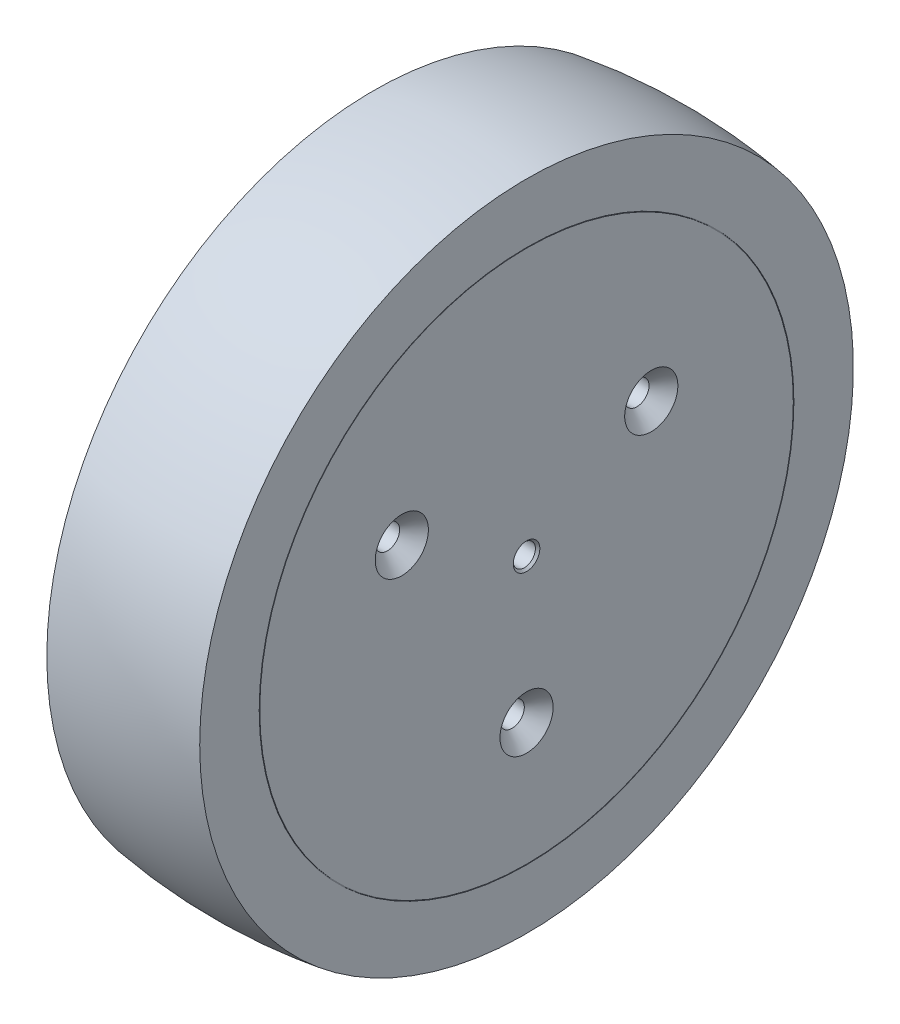
ISO-10303-21;
HEADER;
FILE_DESCRIPTION(('STEP AP214'),'2;1');
FILE_NAME('part.step','',(''),(''),'','','');
FILE_SCHEMA(('AUTOMOTIVE_DESIGN { 1 0 10303 214 1 1 1 1 }'));
ENDSEC;
DATA;
#1=APPLICATION_CONTEXT('core data for automotive mechanical design processes');
#2=APPLICATION_PROTOCOL_DEFINITION('international standard','automotive_design',2000,#1);
#3=PRODUCT_CONTEXT('',#1,'mechanical');
#4=PRODUCT('Part','Part','',(#3));
#5=PRODUCT_RELATED_PRODUCT_CATEGORY('part','',(#4));
#6=PRODUCT_DEFINITION_FORMATION('','',#4);
#7=PRODUCT_DEFINITION_CONTEXT('part definition',#1,'design');
#8=PRODUCT_DEFINITION('design','',#6,#7);
#9=PRODUCT_DEFINITION_SHAPE('','',#8);
#10=(LENGTH_UNIT() NAMED_UNIT(*) SI_UNIT(.MILLI.,.METRE.));
#11=(NAMED_UNIT(*) PLANE_ANGLE_UNIT() SI_UNIT($,.RADIAN.));
#12=(NAMED_UNIT(*) SI_UNIT($,.STERADIAN.) SOLID_ANGLE_UNIT());
#13=UNCERTAINTY_MEASURE_WITH_UNIT(LENGTH_MEASURE(1.E-05),#10,'distance_accuracy_value','');
#14=(GEOMETRIC_REPRESENTATION_CONTEXT(3) GLOBAL_UNCERTAINTY_ASSIGNED_CONTEXT((#13)) GLOBAL_UNIT_ASSIGNED_CONTEXT((#10,
#11,#12)) REPRESENTATION_CONTEXT('',''));
#15=CARTESIAN_POINT('',(0.,0.,0.));
#16=DIRECTION('',(0.,0.,1.));
#17=DIRECTION('',(1.,0.,0.));
#18=AXIS2_PLACEMENT_3D('',#15,#16,#17);
#19=CARTESIAN_POINT('',(0.,-60.3117360156316,-1.26495999176649));
#20=DIRECTION('',(-1.,0.,0.));
#21=DIRECTION('',(0.,0.,1.));
#22=AXIS2_PLACEMENT_3D('',#19,#20,#21);
#23=PLANE('',#22);
#24=CARTESIAN_POINT('',(0.,0.,0.));
#25=DIRECTION('',(1.,0.,0.));
#26=DIRECTION('',(0.,0.,-1.));
#27=AXIS2_PLACEMENT_3D('',#24,#25,#26);
#28=CIRCLE('',#27,56.325);
#29=CARTESIAN_POINT('',(0.,0.,-56.325));
#30=VERTEX_POINT('',#29);
#31=EDGE_CURVE('E49',#30,#30,#28,.T.);
#32=ORIENTED_EDGE('',*,*,#31,.T.);
#33=EDGE_LOOP('',(#32));
#34=FACE_BOUND('',#33,.T.);
#35=CARTESIAN_POINT('',(0.,0.,0.));
#36=DIRECTION('',(-1.,0.,0.));
#37=DIRECTION('',(0.,0.,1.));
#38=AXIS2_PLACEMENT_3D('',#35,#36,#37);
#39=CIRCLE('',#38,60.198);
#40=CARTESIAN_POINT('',(0.,0.,60.198));
#41=VERTEX_POINT('',#40);
#42=EDGE_CURVE('E146',#41,#41,#39,.T.);
#43=ORIENTED_EDGE('',*,*,#42,.T.);
#44=EDGE_LOOP('',(#43));
#45=FACE_BOUND('',#44,.T.);
#46=ADVANCED_FACE('F36',(#34,#45),#23,.T.);
#47=CARTESIAN_POINT('',(34.5,-73.7337841881944,-1.54646994434776));
#48=DIRECTION('',(1.,0.,0.));
#49=DIRECTION('',(0.,0.,-1.));
#50=AXIS2_PLACEMENT_3D('',#47,#48,#49);
#51=PLANE('',#50);
#52=CARTESIAN_POINT('',(34.4999999199445,-32.5,0.));
#53=DIRECTION('',(1.,0.,0.));
#54=DIRECTION('',(0.,0.,-1.));
#55=AXIS2_PLACEMENT_3D('',#52,#53,#54);
#56=CIRCLE('',#55,6.00000000002865);
#57=CARTESIAN_POINT('',(34.4999999199445,-32.5,-6.00000000002865));
#58=VERTEX_POINT('',#57);
#59=EDGE_CURVE('E72',#58,#58,#56,.F.);
#60=ORIENTED_EDGE('',*,*,#59,.T.);
#61=EDGE_LOOP('',(#60));
#62=FACE_BOUND('',#61,.T.);
#63=CARTESIAN_POINT('',(34.4999999199379,16.25,-28.1458256229943));
#64=DIRECTION('',(1.,0.,0.));
#65=DIRECTION('',(0.,0.,-1.));
#66=AXIS2_PLACEMENT_3D('',#63,#64,#65);
#67=CIRCLE('',#66,6.00000000001094);
#68=CARTESIAN_POINT('',(34.4999999199379,16.25,-34.1458256230052));
#69=VERTEX_POINT('',#68);
#70=EDGE_CURVE('E67',#69,#69,#67,.F.);
#71=ORIENTED_EDGE('',*,*,#70,.T.);
#72=EDGE_LOOP('',(#71));
#73=FACE_BOUND('',#72,.T.);
#74=CARTESIAN_POINT('',(34.4999999199445,16.25,28.1458256229943));
#75=DIRECTION('',(1.,0.,0.));
#76=DIRECTION('',(0.,0.,-1.));
#77=AXIS2_PLACEMENT_3D('',#74,#75,#76);
#78=CIRCLE('',#77,5.9999999999642);
#79=CARTESIAN_POINT('',(34.4999999199445,16.25,22.1458256230301));
#80=VERTEX_POINT('',#79);
#81=EDGE_CURVE('E62',#80,#80,#78,.F.);
#82=ORIENTED_EDGE('',*,*,#81,.T.);
#83=EDGE_LOOP('',(#82));
#84=FACE_BOUND('',#83,.T.);
#85=CARTESIAN_POINT('',(34.4999999199445,0.,0.));
#86=DIRECTION('',(1.,0.,0.));
#87=DIRECTION('',(0.,0.,-1.));
#88=AXIS2_PLACEMENT_3D('',#85,#86,#87);
#89=CIRCLE('',#88,2.99999999992906);
#90=CARTESIAN_POINT('',(34.4999999199445,0.,-2.99999999992906));
#91=VERTEX_POINT('',#90);
#92=EDGE_CURVE('E57',#91,#91,#89,.F.);
#93=ORIENTED_EDGE('',*,*,#92,.T.);
#94=EDGE_LOOP('',(#93));
#95=FACE_BOUND('',#94,.T.);
#96=CARTESIAN_POINT('',(34.5,0.,0.));
#97=DIRECTION('',(1.,0.,0.));
#98=DIRECTION('',(0.,0.,-1.));
#99=AXIS2_PLACEMENT_3D('',#96,#97,#98);
#100=CIRCLE('',#99,60.198);
#101=CARTESIAN_POINT('',(34.5,0.,-60.198));
#102=VERTEX_POINT('',#101);
#103=EDGE_CURVE('E134',#102,#102,#100,.T.);
#104=ORIENTED_EDGE('',*,*,#103,.T.);
#105=EDGE_LOOP('',(#104));
#106=FACE_BOUND('',#105,.T.);
#107=ADVANCED_FACE('F179',(#62,#73,#84,#95,#106),#51,.T.);
#108=CARTESIAN_POINT('',(27.9999999199845,0.,0.));
#109=DIRECTION('',(-1.,0.,0.));
#110=DIRECTION('',(0.,0.,1.));
#111=AXIS2_PLACEMENT_3D('',#108,#109,#110);
#112=CONICAL_SURFACE('',#111,3.49999999991724,0.785398163397448);
#113=CARTESIAN_POINT('',(27.9999999199276,0.,0.));
#114=DIRECTION('',(-1.,0.,0.));
#115=DIRECTION('',(0.,0.,1.));
#116=AXIS2_PLACEMENT_3D('',#113,#114,#115);
#117=CIRCLE('',#116,3.49999999997408);
#118=CARTESIAN_POINT('',(27.9999999199276,0.,3.49999999997408));
#119=VERTEX_POINT('',#118);
#120=EDGE_CURVE('E85',#119,#119,#117,.F.);
#121=ORIENTED_EDGE('',*,*,#120,.F.);
#122=EDGE_LOOP('',(#121));
#123=FACE_BOUND('',#122,.T.);
#124=CARTESIAN_POINT('',(28.9999999199296,0.,0.));
#125=DIRECTION('',(1.,0.,0.));
#126=DIRECTION('',(0.,0.,-1.));
#127=AXIS2_PLACEMENT_3D('',#124,#125,#126);
#128=CIRCLE('',#127,2.5);
#129=CARTESIAN_POINT('',(28.9999999199296,0.,-2.5));
#130=VERTEX_POINT('',#129);
#131=EDGE_CURVE('E102',#130,#130,#128,.T.);
#132=ORIENTED_EDGE('',*,*,#131,.T.);
#133=EDGE_LOOP('',(#132));
#134=FACE_BOUND('',#133,.T.);
#135=ADVANCED_FACE('F192',(#123,#134),#112,.F.);
#136=CARTESIAN_POINT('',(-139.577841847698,-32.5,0.));
#137=DIRECTION('',(1.,0.,0.));
#138=DIRECTION('',(0.,0.,-1.));
#139=AXIS2_PLACEMENT_3D('',#136,#137,#138);
#140=CYLINDRICAL_SURFACE('',#139,2.75);
#141=CARTESIAN_POINT('',(31.2499999199076,-32.5,0.));
#142=DIRECTION('',(1.,0.,0.));
#143=DIRECTION('',(0.,0.,-1.));
#144=AXIS2_PLACEMENT_3D('',#141,#142,#143);
#145=CIRCLE('',#144,2.74999999999181);
#146=CARTESIAN_POINT('',(31.2499999199076,-32.5,-2.74999999999181));
#147=VERTEX_POINT('',#146);
#148=EDGE_CURVE('E88',#147,#147,#145,.T.);
#149=ORIENTED_EDGE('',*,*,#148,.T.);
#150=EDGE_LOOP('',(#149));
#151=FACE_BOUND('',#150,.T.);
#152=CARTESIAN_POINT('',(27.9999999199296,-32.5,0.));
#153=DIRECTION('',(1.,0.,0.));
#154=DIRECTION('',(0.,0.,-1.));
#155=AXIS2_PLACEMENT_3D('',#152,#153,#154);
#156=CIRCLE('',#155,2.75);
#157=CARTESIAN_POINT('',(27.9999999199296,-32.5,-2.75));
#158=VERTEX_POINT('',#157);
#159=EDGE_CURVE('E99',#158,#158,#156,.T.);
#160=ORIENTED_EDGE('',*,*,#159,.F.);
#161=EDGE_LOOP('',(#160));
#162=FACE_BOUND('',#161,.T.);
#163=ADVANCED_FACE('F215',(#151,#162),#140,.F.);
#164=CARTESIAN_POINT('',(-139.577841847698,16.25,-28.1458256229943));
#165=DIRECTION('',(1.,0.,0.));
#166=DIRECTION('',(0.,0.,-1.));
#167=AXIS2_PLACEMENT_3D('',#164,#165,#166);
#168=CYLINDRICAL_SURFACE('',#167,2.75);
#169=CARTESIAN_POINT('',(31.2499999199076,16.25,-28.1458256229943));
#170=DIRECTION('',(1.,0.,0.));
#171=DIRECTION('',(0.,0.86602540377722,0.500000000012503));
#172=AXIS2_PLACEMENT_3D('',#169,#170,#171);
#173=CIRCLE('',#172,2.74999999996927);
#174=CARTESIAN_POINT('',(31.2499999199076,18.6315698603607,-26.7708256229753));
#175=VERTEX_POINT('',#174);
#176=EDGE_CURVE('E117',#175,#175,#173,.T.);
#177=ORIENTED_EDGE('',*,*,#176,.T.);
#178=EDGE_LOOP('',(#177));
#179=FACE_BOUND('',#178,.T.);
#180=CARTESIAN_POINT('',(27.9999999199296,16.25,-28.1458256229943));
#181=DIRECTION('',(1.,0.,0.));
#182=DIRECTION('',(0.,0.,-1.));
#183=AXIS2_PLACEMENT_3D('',#180,#181,#182);
#184=CIRCLE('',#183,2.75);
#185=CARTESIAN_POINT('',(27.9999999199296,16.25,-30.8958256229943));
#186=VERTEX_POINT('',#185);
#187=EDGE_CURVE('E94',#186,#186,#184,.T.);
#188=ORIENTED_EDGE('',*,*,#187,.F.);
#189=EDGE_LOOP('',(#188));
#190=FACE_BOUND('',#189,.T.);
#191=ADVANCED_FACE('F219',(#179,#190),#168,.F.);
#192=CARTESIAN_POINT('',(-139.577841847698,16.25,28.1458256229943));
#193=DIRECTION('',(1.,0.,0.));
#194=DIRECTION('',(0.,0.,-1.));
#195=AXIS2_PLACEMENT_3D('',#192,#193,#194);
#196=CYLINDRICAL_SURFACE('',#195,2.75);
#197=CARTESIAN_POINT('',(31.2499999199076,16.25,28.1458256229943));
#198=DIRECTION('',(1.,0.,0.));
#199=DIRECTION('',(0.,-0.866025403787185,0.499999999995243));
#200=AXIS2_PLACEMENT_3D('',#197,#198,#199);
#201=CIRCLE('',#200,2.74999999997176);
#202=CARTESIAN_POINT('',(31.2499999199076,13.8684301396097,29.5208256229671));
#203=VERTEX_POINT('',#202);
#204=EDGE_CURVE('E122',#203,#203,#201,.T.);
#205=ORIENTED_EDGE('',*,*,#204,.T.);
#206=EDGE_LOOP('',(#205));
#207=FACE_BOUND('',#206,.T.);
#208=CARTESIAN_POINT('',(27.9999999199296,16.25,28.1458256229943));
#209=DIRECTION('',(1.,0.,0.));
#210=DIRECTION('',(0.,0.,-1.));
#211=AXIS2_PLACEMENT_3D('',#208,#209,#210);
#212=CIRCLE('',#211,2.75);
#213=CARTESIAN_POINT('',(27.9999999199296,16.25,25.3958256229943));
#214=VERTEX_POINT('',#213);
#215=EDGE_CURVE('E89',#214,#214,#212,.T.);
#216=ORIENTED_EDGE('',*,*,#215,.F.);
#217=EDGE_LOOP('',(#216));
#218=FACE_BOUND('',#217,.T.);
#219=ADVANCED_FACE('F226',(#207,#218),#196,.F.);
#220=CARTESIAN_POINT('',(31.2499999199296,0.,0.));
#221=DIRECTION('',(1.,0.,0.));
#222=DIRECTION('',(0.,0.,-1.));
#223=AXIS2_PLACEMENT_3D('',#220,#221,#222);
#224=CYLINDRICAL_SURFACE('',#223,2.5);
#225=ORIENTED_EDGE('',*,*,#131,.F.);
#226=EDGE_LOOP('',(#225));
#227=FACE_BOUND('',#226,.T.);
#228=CARTESIAN_POINT('',(33.9999999200131,0.,0.));
#229=DIRECTION('',(1.,0.,0.));
#230=DIRECTION('',(0.,-1.,0.));
#231=AXIS2_PLACEMENT_3D('',#228,#229,#230);
#232=CIRCLE('',#231,2.49999999999773);
#233=CARTESIAN_POINT('',(33.9999999200131,-2.49999999999773,0.));
#234=VERTEX_POINT('',#233);
#235=EDGE_CURVE('E82',#234,#234,#232,.T.);
#236=ORIENTED_EDGE('',*,*,#235,.T.);
#237=EDGE_LOOP('',(#236));
#238=FACE_BOUND('',#237,.T.);
#239=ADVANCED_FACE('F230',(#227,#238),#224,.F.);
#240=CARTESIAN_POINT('',(27.9999999199296,56.325,0.));
#241=DIRECTION('',(-1.,0.,0.));
#242=DIRECTION('',(0.,0.,1.));
#243=AXIS2_PLACEMENT_3D('',#240,#241,#242);
#244=PLANE('',#243);
#245=ORIENTED_EDGE('',*,*,#120,.T.);
#246=EDGE_LOOP('',(#245));
#247=FACE_BOUND('',#246,.T.);
#248=ORIENTED_EDGE('',*,*,#215,.T.);
#249=EDGE_LOOP('',(#248));
#250=FACE_BOUND('',#249,.T.);
#251=ORIENTED_EDGE('',*,*,#187,.T.);
#252=EDGE_LOOP('',(#251));
#253=FACE_BOUND('',#252,.T.);
#254=ORIENTED_EDGE('',*,*,#159,.T.);
#255=EDGE_LOOP('',(#254));
#256=FACE_BOUND('',#255,.T.);
#257=CARTESIAN_POINT('',(27.9999999199296,0.,0.));
#258=DIRECTION('',(1.,0.,0.));
#259=DIRECTION('',(0.,0.,-1.));
#260=AXIS2_PLACEMENT_3D('',#257,#258,#259);
#261=CIRCLE('',#260,56.325);
#262=CARTESIAN_POINT('',(27.9999999199296,0.,-56.325));
#263=VERTEX_POINT('',#262);
#264=EDGE_CURVE('E77',#263,#263,#261,.F.);
#265=ORIENTED_EDGE('',*,*,#264,.T.);
#266=EDGE_LOOP('',(#265));
#267=FACE_BOUND('',#266,.T.);
#268=ADVANCED_FACE('F234',(#247,#250,#253,#256,#267),#244,.T.);
#269=CARTESIAN_POINT('',(34.4999999199445,-32.5,0.));
#270=DIRECTION('',(1.,0.,0.));
#271=DIRECTION('',(0.,0.,-1.));
#272=AXIS2_PLACEMENT_3D('',#269,#270,#271);
#273=CONICAL_SURFACE('',#272,6.00000000002865,0.785398163397448);
#274=ORIENTED_EDGE('',*,*,#148,.F.);
#275=EDGE_LOOP('',(#274));
#276=FACE_BOUND('',#275,.T.);
#277=ORIENTED_EDGE('',*,*,#59,.F.);
#278=EDGE_LOOP('',(#277));
#279=FACE_BOUND('',#278,.T.);
#280=ADVANCED_FACE('F237',(#276,#279),#273,.F.);
#281=CARTESIAN_POINT('',(34.4999999200013,16.25,-28.1458256229943));
#282=DIRECTION('',(1.,0.,0.));
#283=DIRECTION('',(0.,0.,-1.));
#284=AXIS2_PLACEMENT_3D('',#281,#282,#283);
#285=CONICAL_SURFACE('',#284,6.00000000007438,0.785398163399207);
#286=ORIENTED_EDGE('',*,*,#176,.F.);
#287=EDGE_LOOP('',(#286));
#288=FACE_BOUND('',#287,.T.);
#289=ORIENTED_EDGE('',*,*,#70,.F.);
#290=EDGE_LOOP('',(#289));
#291=FACE_BOUND('',#290,.T.);
#292=ADVANCED_FACE('F241',(#288,#291),#285,.F.);
#293=CARTESIAN_POINT('',(34.4999999199445,16.25,28.1458256229943));
#294=DIRECTION('',(1.,0.,0.));
#295=DIRECTION('',(0.,0.,-1.));
#296=AXIS2_PLACEMENT_3D('',#293,#294,#295);
#297=CONICAL_SURFACE('',#296,5.9999999999642,0.785398163398349);
#298=ORIENTED_EDGE('',*,*,#204,.F.);
#299=EDGE_LOOP('',(#298));
#300=FACE_BOUND('',#299,.T.);
#301=ORIENTED_EDGE('',*,*,#81,.F.);
#302=EDGE_LOOP('',(#301));
#303=FACE_BOUND('',#302,.T.);
#304=ADVANCED_FACE('F245',(#300,#303),#297,.F.);
#305=CARTESIAN_POINT('',(34.4999999199445,0.,0.));
#306=DIRECTION('',(1.,0.,0.));
#307=DIRECTION('',(0.,0.,-1.));
#308=AXIS2_PLACEMENT_3D('',#305,#306,#307);
#309=CONICAL_SURFACE('',#308,2.99999999992906,0.785398163397448);
#310=ORIENTED_EDGE('',*,*,#235,.F.);
#311=EDGE_LOOP('',(#310));
#312=FACE_BOUND('',#311,.T.);
#313=ORIENTED_EDGE('',*,*,#92,.F.);
#314=EDGE_LOOP('',(#313));
#315=FACE_BOUND('',#314,.T.);
#316=ADVANCED_FACE('F249',(#312,#315),#309,.F.);
#317=CARTESIAN_POINT('',(13.9999999599648,0.,0.));
#318=DIRECTION('',(1.,0.,0.));
#319=DIRECTION('',(0.,0.,-1.));
#320=AXIS2_PLACEMENT_3D('',#317,#318,#319);
#321=CYLINDRICAL_SURFACE('',#320,56.325);
#322=ORIENTED_EDGE('',*,*,#31,.F.);
#323=EDGE_LOOP('',(#322));
#324=FACE_BOUND('',#323,.T.);
#325=ORIENTED_EDGE('',*,*,#264,.F.);
#326=EDGE_LOOP('',(#325));
#327=FACE_BOUND('',#326,.T.);
#328=ADVANCED_FACE('F181',(#324,#327),#321,.F.);
#329=CARTESIAN_POINT('',(34.5,0.,0.));
#330=DIRECTION('',(1.,0.,0.));
#331=DIRECTION('',(0.,0.,-1.));
#332=AXIS2_PLACEMENT_3D('',#329,#330,#331);
#333=CIRCLE('',#332,60.325);
#334=CARTESIAN_POINT('',(34.5,0.,-60.325));
#335=VERTEX_POINT('',#334);
#336=EDGE_CURVE('E110',#335,#335,#333,.T.);
#337=ORIENTED_EDGE('',*,*,#336,.F.);
#338=EDGE_LOOP('',(#337));
#339=FACE_BOUND('',#338,.T.);
#340=CARTESIAN_POINT('',(34.5,0.,0.));
#341=DIRECTION('',(-1.,0.,0.));
#342=DIRECTION('',(0.,0.,1.));
#343=AXIS2_PLACEMENT_3D('',#340,#341,#342);
#344=CIRCLE('',#343,73.75);
#345=CARTESIAN_POINT('',(34.5,0.,73.75));
#346=VERTEX_POINT('',#345);
#347=EDGE_CURVE('E44',#346,#346,#344,.F.);
#348=ORIENTED_EDGE('',*,*,#347,.T.);
#349=EDGE_LOOP('',(#348));
#350=FACE_BOUND('',#349,.T.);
#351=ADVANCED_FACE('F170',(#339,#350),#51,.T.);
#352=CARTESIAN_POINT('',(0.,0.,0.));
#353=DIRECTION('',(-1.,0.,0.));
#354=DIRECTION('',(0.,0.,1.));
#355=AXIS2_PLACEMENT_3D('',#352,#353,#354);
#356=CIRCLE('',#355,60.325);
#357=CARTESIAN_POINT('',(0.,0.,60.325));
#358=VERTEX_POINT('',#357);
#359=EDGE_CURVE('E140',#358,#358,#356,.T.);
#360=ORIENTED_EDGE('',*,*,#359,.F.);
#361=EDGE_LOOP('',(#360));
#362=FACE_BOUND('',#361,.T.);
#363=CARTESIAN_POINT('',(0.,0.,0.));
#364=DIRECTION('',(-1.,0.,0.));
#365=DIRECTION('',(0.,0.,1.));
#366=AXIS2_PLACEMENT_3D('',#363,#364,#365);
#367=CIRCLE('',#366,73.75);
#368=CARTESIAN_POINT('',(0.,0.,73.75));
#369=VERTEX_POINT('',#368);
#370=EDGE_CURVE('E10',#369,#369,#367,.T.);
#371=ORIENTED_EDGE('',*,*,#370,.T.);
#372=EDGE_LOOP('',(#371));
#373=FACE_BOUND('',#372,.T.);
#374=ADVANCED_FACE('F168',(#362,#373),#23,.T.);
#375=CARTESIAN_POINT('',(17.25,0.,0.));
#376=DIRECTION('',(-1.,0.,0.));
#377=DIRECTION('',(0.,0.,1.));
#378=AXIS2_PLACEMENT_3D('',#375,#376,#377);
#379=DEGENERATE_TOROIDAL_SURFACE('',#378,44.6499999999984,119.649999999998,.F.);
#380=ORIENTED_EDGE('',*,*,#347,.F.);
#381=EDGE_LOOP('',(#380));
#382=FACE_BOUND('',#381,.T.);
#383=ORIENTED_EDGE('',*,*,#370,.F.);
#384=EDGE_LOOP('',(#383));
#385=FACE_BOUND('',#384,.T.);
#386=ADVANCED_FACE('F38',(#382,#385),#379,.F.);
#387=CARTESIAN_POINT('',(34.246,0.,0.));
#388=DIRECTION('',(1.,0.,0.));
#389=DIRECTION('',(0.,0.,-1.));
#390=AXIS2_PLACEMENT_3D('',#387,#388,#389);
#391=CYLINDRICAL_SURFACE('',#390,60.325);
#392=CARTESIAN_POINT('',(34.246,0.,0.));
#393=DIRECTION('',(1.,0.,0.));
#394=DIRECTION('',(0.,0.,-1.));
#395=AXIS2_PLACEMENT_3D('',#392,#393,#394);
#396=CIRCLE('',#395,60.325);
#397=CARTESIAN_POINT('',(34.246,0.,-60.325));
#398=VERTEX_POINT('',#397);
#399=EDGE_CURVE('E106',#398,#398,#396,.T.);
#400=ORIENTED_EDGE('',*,*,#399,.F.);
#401=EDGE_LOOP('',(#400));
#402=FACE_BOUND('',#401,.T.);
#403=ORIENTED_EDGE('',*,*,#336,.T.);
#404=EDGE_LOOP('',(#403));
#405=FACE_BOUND('',#404,.T.);
#406=ADVANCED_FACE('F177',(#402,#405),#391,.F.);
#407=CARTESIAN_POINT('',(34.246,0.,0.));
#408=DIRECTION('',(1.,0.,0.));
#409=DIRECTION('',(0.,0.,-1.));
#410=AXIS2_PLACEMENT_3D('',#407,#408,#409);
#411=PLANE('',#410);
#412=CARTESIAN_POINT('',(34.246,0.,0.));
#413=DIRECTION('',(1.,0.,0.));
#414=DIRECTION('',(0.,0.,-1.));
#415=AXIS2_PLACEMENT_3D('',#412,#413,#414);
#416=CIRCLE('',#415,60.198);
#417=CARTESIAN_POINT('',(34.246,0.,-60.198));
#418=VERTEX_POINT('',#417);
#419=EDGE_CURVE('E132',#418,#418,#416,.T.);
#420=ORIENTED_EDGE('',*,*,#419,.F.);
#421=EDGE_LOOP('',(#420));
#422=FACE_BOUND('',#421,.T.);
#423=ORIENTED_EDGE('',*,*,#399,.T.);
#424=EDGE_LOOP('',(#423));
#425=FACE_BOUND('',#424,.T.);
#426=ADVANCED_FACE('F204',(#422,#425),#411,.T.);
#427=CARTESIAN_POINT('',(34.246,0.,0.));
#428=DIRECTION('',(1.,0.,0.));
#429=DIRECTION('',(0.,0.,-1.));
#430=AXIS2_PLACEMENT_3D('',#427,#428,#429);
#431=CYLINDRICAL_SURFACE('',#430,60.198);
#432=ORIENTED_EDGE('',*,*,#419,.T.);
#433=EDGE_LOOP('',(#432));
#434=FACE_BOUND('',#433,.T.);
#435=ORIENTED_EDGE('',*,*,#103,.F.);
#436=EDGE_LOOP('',(#435));
#437=FACE_BOUND('',#436,.T.);
#438=ADVANCED_FACE('F164',(#434,#437),#431,.T.);
#439=CARTESIAN_POINT('',(0.254,0.,0.));
#440=DIRECTION('',(-1.,0.,0.));
#441=DIRECTION('',(0.,0.,1.));
#442=AXIS2_PLACEMENT_3D('',#439,#440,#441);
#443=CYLINDRICAL_SURFACE('',#442,60.325);
#444=CARTESIAN_POINT('',(0.254,0.,0.));
#445=DIRECTION('',(-1.,0.,0.));
#446=DIRECTION('',(0.,0.,1.));
#447=AXIS2_PLACEMENT_3D('',#444,#445,#446);
#448=CIRCLE('',#447,60.325);
#449=CARTESIAN_POINT('',(0.254,0.,60.325));
#450=VERTEX_POINT('',#449);
#451=EDGE_CURVE('E137',#450,#450,#448,.T.);
#452=ORIENTED_EDGE('',*,*,#451,.F.);
#453=EDGE_LOOP('',(#452));
#454=FACE_BOUND('',#453,.T.);
#455=ORIENTED_EDGE('',*,*,#359,.T.);
#456=EDGE_LOOP('',(#455));
#457=FACE_BOUND('',#456,.T.);
#458=ADVANCED_FACE('F158',(#454,#457),#443,.F.);
#459=CARTESIAN_POINT('',(0.254,0.,0.));
#460=DIRECTION('',(-1.,0.,0.));
#461=DIRECTION('',(0.,0.,1.));
#462=AXIS2_PLACEMENT_3D('',#459,#460,#461);
#463=PLANE('',#462);
#464=CARTESIAN_POINT('',(0.254,0.,0.));
#465=DIRECTION('',(-1.,0.,0.));
#466=DIRECTION('',(0.,0.,1.));
#467=AXIS2_PLACEMENT_3D('',#464,#465,#466);
#468=CIRCLE('',#467,60.198);
#469=CARTESIAN_POINT('',(0.254,0.,60.198));
#470=VERTEX_POINT('',#469);
#471=EDGE_CURVE('E143',#470,#470,#468,.T.);
#472=ORIENTED_EDGE('',*,*,#471,.F.);
#473=EDGE_LOOP('',(#472));
#474=FACE_BOUND('',#473,.T.);
#475=ORIENTED_EDGE('',*,*,#451,.T.);
#476=EDGE_LOOP('',(#475));
#477=FACE_BOUND('',#476,.T.);
#478=ADVANCED_FACE('F155',(#474,#477),#463,.T.);
#479=CARTESIAN_POINT('',(0.254,0.,0.));
#480=DIRECTION('',(-1.,0.,0.));
#481=DIRECTION('',(0.,0.,1.));
#482=AXIS2_PLACEMENT_3D('',#479,#480,#481);
#483=CYLINDRICAL_SURFACE('',#482,60.198);
#484=ORIENTED_EDGE('',*,*,#471,.T.);
#485=EDGE_LOOP('',(#484));
#486=FACE_BOUND('',#485,.T.);
#487=ORIENTED_EDGE('',*,*,#42,.F.);
#488=EDGE_LOOP('',(#487));
#489=FACE_BOUND('',#488,.T.);
#490=ADVANCED_FACE('F152',(#486,#489),#483,.T.);
#491=CLOSED_SHELL('',(#46,#107,#135,#163,#191,#219,#239,#268,#280,#292,#304,#316,#328,#351,#374,
#386,#406,#426,#438,#458,#478,#490));
#492=MANIFOLD_SOLID_BREP('B2',#491);
#493=ADVANCED_BREP_SHAPE_REPRESENTATION('',(#18,#492),#14);
#494=SHAPE_DEFINITION_REPRESENTATION(#9,#493);
ENDSEC;
END-ISO-10303-21;
